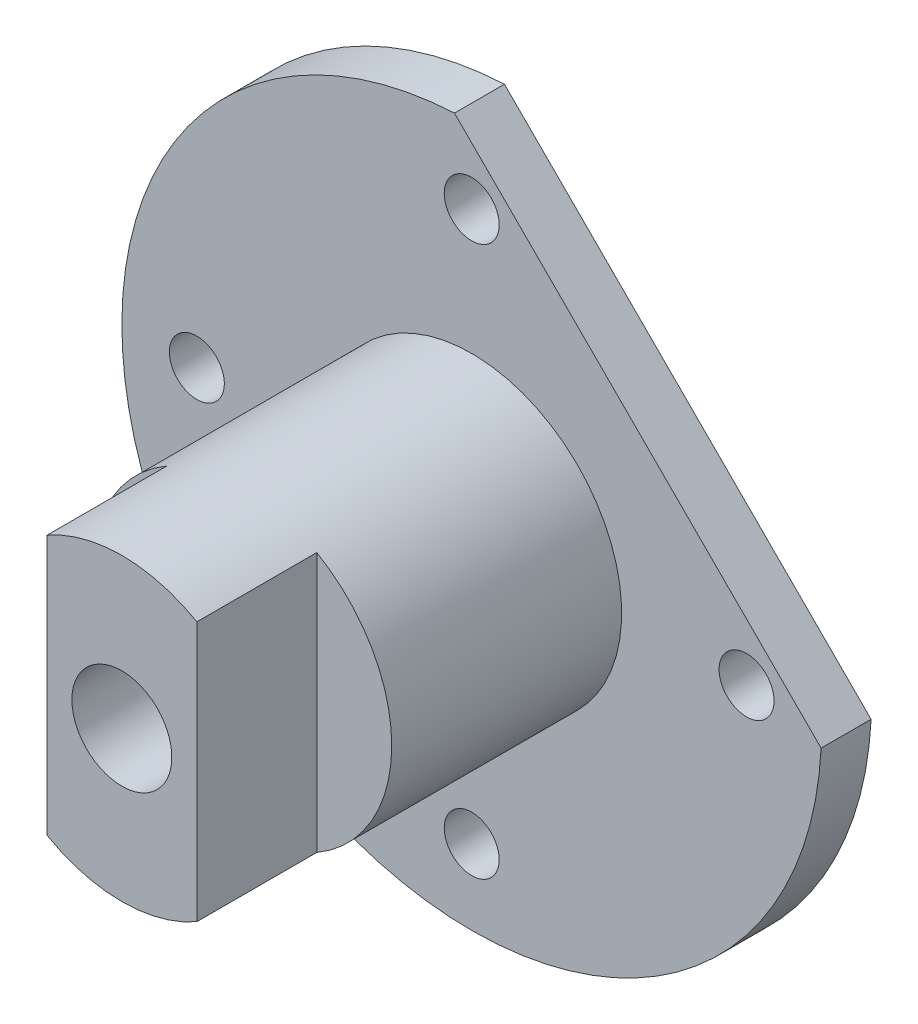
ISO-10303-21;
HEADER;
FILE_DESCRIPTION(('STEP AP214'),'2;1');
FILE_NAME('part.step','',(''),(''),'','','');
FILE_SCHEMA(('AUTOMOTIVE_DESIGN { 1 0 10303 214 1 1 1 1 }'));
ENDSEC;
DATA;
#1=APPLICATION_CONTEXT('core data for automotive mechanical design processes');
#2=APPLICATION_PROTOCOL_DEFINITION('international standard','automotive_design',2000,#1);
#3=PRODUCT_CONTEXT('',#1,'mechanical');
#4=PRODUCT('Part','Part','',(#3));
#5=PRODUCT_RELATED_PRODUCT_CATEGORY('part','',(#4));
#6=PRODUCT_DEFINITION_FORMATION('','',#4);
#7=PRODUCT_DEFINITION_CONTEXT('part definition',#1,'design');
#8=PRODUCT_DEFINITION('design','',#6,#7);
#9=PRODUCT_DEFINITION_SHAPE('','',#8);
#10=(LENGTH_UNIT() NAMED_UNIT(*) SI_UNIT(.MILLI.,.METRE.));
#11=(NAMED_UNIT(*) PLANE_ANGLE_UNIT() SI_UNIT($,.RADIAN.));
#12=(NAMED_UNIT(*) SI_UNIT($,.STERADIAN.) SOLID_ANGLE_UNIT());
#13=UNCERTAINTY_MEASURE_WITH_UNIT(LENGTH_MEASURE(1.E-05),#10,'distance_accuracy_value','');
#14=(GEOMETRIC_REPRESENTATION_CONTEXT(3) GLOBAL_UNCERTAINTY_ASSIGNED_CONTEXT((#13)) GLOBAL_UNIT_ASSIGNED_CONTEXT((#10,
#11,#12)) REPRESENTATION_CONTEXT('',''));
#15=CARTESIAN_POINT('',(0.,0.,0.));
#16=DIRECTION('',(0.,0.,1.));
#17=DIRECTION('',(1.,0.,0.));
#18=AXIS2_PLACEMENT_3D('',#15,#16,#17);
#19=CARTESIAN_POINT('',(0.,0.,40.));
#20=DIRECTION('',(0.,0.,-1.));
#21=DIRECTION('',(-1.,0.,0.));
#22=AXIS2_PLACEMENT_3D('',#19,#20,#21);
#23=CYLINDRICAL_SURFACE('',#22,15.);
#24=CARTESIAN_POINT('',(0.,0.,5.));
#25=DIRECTION('',(0.,0.,-1.));
#26=DIRECTION('',(-1.,0.,0.));
#27=AXIS2_PLACEMENT_3D('',#24,#25,#26);
#28=CIRCLE('',#27,15.);
#29=CARTESIAN_POINT('',(-15.,0.,5.));
#30=VERTEX_POINT('',#29);
#31=EDGE_CURVE('E146',#30,#30,#28,.T.);
#32=ORIENTED_EDGE('',*,*,#31,.F.);
#33=EDGE_LOOP('',(#32));
#34=FACE_BOUND('',#33,.T.);
#35=DIRECTION('',(0.,0.,-1.));
#36=VECTOR('',#35,1.);
#37=CARTESIAN_POINT('',(-7.5,12.9903810567666,40.));
#38=LINE('',#37,#36);
#39=CARTESIAN_POINT('',(-7.5,12.9903810567666,40.));
#40=VERTEX_POINT('',#39);
#41=CARTESIAN_POINT('',(-7.5,12.9903810567666,28.));
#42=VERTEX_POINT('',#41);
#43=EDGE_CURVE('E176',#40,#42,#38,.T.);
#44=ORIENTED_EDGE('',*,*,#43,.F.);
#45=CARTESIAN_POINT('',(0.,0.,40.));
#46=DIRECTION('',(0.,0.,1.));
#47=DIRECTION('',(1.,0.,0.));
#48=AXIS2_PLACEMENT_3D('',#45,#46,#47);
#49=CIRCLE('',#48,15.);
#50=CARTESIAN_POINT('',(7.5,12.9903810567666,40.));
#51=VERTEX_POINT('',#50);
#52=EDGE_CURVE('E143',#51,#40,#49,.T.);
#53=ORIENTED_EDGE('',*,*,#52,.F.);
#54=DIRECTION('',(0.,0.,-1.));
#55=VECTOR('',#54,1.);
#56=CARTESIAN_POINT('',(7.5,12.9903810567666,40.));
#57=LINE('',#56,#55);
#58=CARTESIAN_POINT('',(7.5,12.9903810567666,28.));
#59=VERTEX_POINT('',#58);
#60=EDGE_CURVE('E171',#51,#59,#57,.T.);
#61=ORIENTED_EDGE('',*,*,#60,.T.);
#62=CARTESIAN_POINT('',(0.,0.,28.));
#63=DIRECTION('',(0.,0.,-1.));
#64=DIRECTION('',(-1.,0.,0.));
#65=AXIS2_PLACEMENT_3D('',#62,#63,#64);
#66=CIRCLE('',#65,15.);
#67=CARTESIAN_POINT('',(7.5,-12.9903810567666,28.));
#68=VERTEX_POINT('',#67);
#69=EDGE_CURVE('E155',#59,#68,#66,.T.);
#70=ORIENTED_EDGE('',*,*,#69,.T.);
#71=DIRECTION('',(0.,0.,-1.));
#72=VECTOR('',#71,1.);
#73=CARTESIAN_POINT('',(7.5,-12.9903810567666,40.));
#74=LINE('',#73,#72);
#75=CARTESIAN_POINT('',(7.5,-12.9903810567666,40.));
#76=VERTEX_POINT('',#75);
#77=EDGE_CURVE('E166',#68,#76,#74,.F.);
#78=ORIENTED_EDGE('',*,*,#77,.T.);
#79=CARTESIAN_POINT('',(-7.5,-12.9903810567666,40.));
#80=VERTEX_POINT('',#79);
#81=EDGE_CURVE('E137',#80,#76,#49,.T.);
#82=ORIENTED_EDGE('',*,*,#81,.F.);
#83=DIRECTION('',(0.,0.,-1.));
#84=VECTOR('',#83,1.);
#85=CARTESIAN_POINT('',(-7.5,-12.9903810567666,40.));
#86=LINE('',#85,#84);
#87=CARTESIAN_POINT('',(-7.5,-12.9903810567666,28.));
#88=VERTEX_POINT('',#87);
#89=EDGE_CURVE('E54',#88,#80,#86,.F.);
#90=ORIENTED_EDGE('',*,*,#89,.F.);
#91=CARTESIAN_POINT('',(0.,0.,28.));
#92=DIRECTION('',(0.,0.,1.));
#93=DIRECTION('',(1.,0.,0.));
#94=AXIS2_PLACEMENT_3D('',#91,#92,#93);
#95=CIRCLE('',#94,15.);
#96=EDGE_CURVE('E11',#42,#88,#95,.T.);
#97=ORIENTED_EDGE('',*,*,#96,.F.);
#98=EDGE_LOOP('',(#44,#53,#61,#70,#78,#82,#90,#97));
#99=FACE_BOUND('',#98,.T.);
#100=ADVANCED_FACE('F32',(#34,#99),#23,.T.);
#101=CARTESIAN_POINT('',(0.,0.,40.));
#102=DIRECTION('',(0.,0.,1.));
#103=DIRECTION('',(1.,0.,0.));
#104=AXIS2_PLACEMENT_3D('',#101,#102,#103);
#105=PLANE('',#104);
#106=CARTESIAN_POINT('',(0.,0.,40.));
#107=DIRECTION('',(0.,0.,-1.));
#108=DIRECTION('',(-1.,0.,0.));
#109=AXIS2_PLACEMENT_3D('',#106,#107,#108);
#110=CIRCLE('',#109,5.);
#111=CARTESIAN_POINT('',(-5.,0.,40.));
#112=VERTEX_POINT('',#111);
#113=EDGE_CURVE('E135',#112,#112,#110,.T.);
#114=ORIENTED_EDGE('',*,*,#113,.T.);
#115=EDGE_LOOP('',(#114));
#116=FACE_BOUND('',#115,.T.);
#117=ORIENTED_EDGE('',*,*,#52,.T.);
#118=DIRECTION('',(0.,-1.,0.));
#119=VECTOR('',#118,1.);
#120=CARTESIAN_POINT('',(-7.5,0.,40.));
#121=LINE('',#120,#119);
#122=EDGE_CURVE('E39',#40,#80,#121,.T.);
#123=ORIENTED_EDGE('',*,*,#122,.T.);
#124=ORIENTED_EDGE('',*,*,#81,.T.);
#125=DIRECTION('',(0.,-1.,0.));
#126=VECTOR('',#125,1.);
#127=CARTESIAN_POINT('',(7.5,0.,40.));
#128=LINE('',#127,#126);
#129=EDGE_CURVE('E149',#51,#76,#128,.T.);
#130=ORIENTED_EDGE('',*,*,#129,.F.);
#131=EDGE_LOOP('',(#117,#123,#124,#130));
#132=FACE_BOUND('',#131,.T.);
#133=ADVANCED_FACE('F159',(#116,#132),#105,.T.);
#134=CARTESIAN_POINT('',(0.,0.,40.));
#135=DIRECTION('',(0.,0.,-1.));
#136=DIRECTION('',(-1.,0.,0.));
#137=AXIS2_PLACEMENT_3D('',#134,#135,#136);
#138=CYLINDRICAL_SURFACE('',#137,5.);
#139=ORIENTED_EDGE('',*,*,#113,.F.);
#140=EDGE_LOOP('',(#139));
#141=FACE_BOUND('',#140,.T.);
#142=CARTESIAN_POINT('',(0.,0.,10.));
#143=DIRECTION('',(0.,0.,-1.));
#144=DIRECTION('',(-1.,0.,0.));
#145=AXIS2_PLACEMENT_3D('',#142,#143,#144);
#146=CIRCLE('',#145,5.);
#147=CARTESIAN_POINT('',(-5.,0.,10.));
#148=VERTEX_POINT('',#147);
#149=EDGE_CURVE('E140',#148,#148,#146,.F.);
#150=ORIENTED_EDGE('',*,*,#149,.F.);
#151=EDGE_LOOP('',(#150));
#152=FACE_BOUND('',#151,.T.);
#153=ADVANCED_FACE('F266',(#141,#152),#138,.F.);
#154=CARTESIAN_POINT('',(0.,0.,5.));
#155=DIRECTION('',(0.,0.,-1.));
#156=DIRECTION('',(-1.,0.,0.));
#157=AXIS2_PLACEMENT_3D('',#154,#155,#156);
#158=PLANE('',#157);
#159=CARTESIAN_POINT('',(0.,27.5,5.));
#160=DIRECTION('',(0.,0.,-1.));
#161=DIRECTION('',(-1.,0.,0.));
#162=AXIS2_PLACEMENT_3D('',#159,#160,#161);
#163=CIRCLE('',#162,2.74999999999999);
#164=CARTESIAN_POINT('',(-2.74999999999999,27.5,5.));
#165=VERTEX_POINT('',#164);
#166=EDGE_CURVE('E429',#165,#165,#163,.T.);
#167=ORIENTED_EDGE('',*,*,#166,.T.);
#168=EDGE_LOOP('',(#167));
#169=FACE_BOUND('',#168,.T.);
#170=CARTESIAN_POINT('',(27.5,0.,5.));
#171=DIRECTION('',(0.,0.,-1.));
#172=DIRECTION('',(-1.,0.,0.));
#173=AXIS2_PLACEMENT_3D('',#170,#171,#172);
#174=CIRCLE('',#173,2.74999999999999);
#175=CARTESIAN_POINT('',(24.75,0.,5.));
#176=VERTEX_POINT('',#175);
#177=EDGE_CURVE('E431',#176,#176,#174,.T.);
#178=ORIENTED_EDGE('',*,*,#177,.T.);
#179=EDGE_LOOP('',(#178));
#180=FACE_BOUND('',#179,.T.);
#181=CARTESIAN_POINT('',(-27.5,0.,5.));
#182=DIRECTION('',(0.,0.,-1.));
#183=DIRECTION('',(-1.,0.,0.));
#184=AXIS2_PLACEMENT_3D('',#181,#182,#183);
#185=CIRCLE('',#184,2.74999999999999);
#186=CARTESIAN_POINT('',(-30.25,0.,5.));
#187=VERTEX_POINT('',#186);
#188=EDGE_CURVE('E310',#187,#187,#185,.T.);
#189=ORIENTED_EDGE('',*,*,#188,.T.);
#190=EDGE_LOOP('',(#189));
#191=FACE_BOUND('',#190,.T.);
#192=CARTESIAN_POINT('',(0.,-27.5,5.));
#193=DIRECTION('',(0.,0.,-1.));
#194=DIRECTION('',(-1.,0.,0.));
#195=AXIS2_PLACEMENT_3D('',#192,#193,#194);
#196=CIRCLE('',#195,2.74999999999999);
#197=CARTESIAN_POINT('',(-2.74999999999999,-27.5,5.));
#198=VERTEX_POINT('',#197);
#199=EDGE_CURVE('E309',#198,#198,#196,.T.);
#200=ORIENTED_EDGE('',*,*,#199,.T.);
#201=EDGE_LOOP('',(#200));
#202=FACE_BOUND('',#201,.T.);
#203=CARTESIAN_POINT('',(0.,0.,5.));
#204=DIRECTION('',(0.,0.,-1.));
#205=DIRECTION('',(-1.,0.,0.));
#206=AXIS2_PLACEMENT_3D('',#203,#204,#205);
#207=CIRCLE('',#206,35.);
#208=CARTESIAN_POINT('',(34.9575382488401,-1.72351953307244,5.));
#209=VERTEX_POINT('',#208);
#210=CARTESIAN_POINT('',(-1.72351953307231,34.9575382488401,5.));
#211=VERTEX_POINT('',#210);
#212=EDGE_CURVE('E131',#209,#211,#207,.T.);
#213=ORIENTED_EDGE('',*,*,#212,.F.);
#214=DIRECTION('',(-0.707106781186546,0.707106781186549,0.));
#215=VECTOR('',#214,1.);
#216=CARTESIAN_POINT('',(16.6170093578839,16.6170093578838,5.));
#217=LINE('',#216,#215);
#218=EDGE_CURVE('E132',#209,#211,#217,.T.);
#219=ORIENTED_EDGE('',*,*,#218,.T.);
#220=EDGE_LOOP('',(#213,#219));
#221=FACE_BOUND('',#220,.T.);
#222=ORIENTED_EDGE('',*,*,#31,.T.);
#223=EDGE_LOOP('',(#222));
#224=FACE_BOUND('',#223,.T.);
#225=ADVANCED_FACE('F271',(#169,#180,#191,#202,#221,#224),#158,.F.);
#226=CARTESIAN_POINT('',(0.,0.,5.));
#227=DIRECTION('',(0.,0.,-1.));
#228=DIRECTION('',(-1.,0.,0.));
#229=AXIS2_PLACEMENT_3D('',#226,#227,#228);
#230=CYLINDRICAL_SURFACE('',#229,35.);
#231=DIRECTION('',(0.,0.,-1.));
#232=VECTOR('',#231,1.);
#233=CARTESIAN_POINT('',(-1.72351953307231,34.9575382488401,40.));
#234=LINE('',#233,#232);
#235=CARTESIAN_POINT('',(-1.72351953307231,34.9575382488401,0.));
#236=VERTEX_POINT('',#235);
#237=EDGE_CURVE('E120',#211,#236,#234,.T.);
#238=ORIENTED_EDGE('',*,*,#237,.T.);
#239=CARTESIAN_POINT('',(0.,0.,0.));
#240=DIRECTION('',(0.,0.,-1.));
#241=DIRECTION('',(-1.,0.,0.));
#242=AXIS2_PLACEMENT_3D('',#239,#240,#241);
#243=CIRCLE('',#242,35.);
#244=CARTESIAN_POINT('',(34.9575382488401,-1.72351953307245,0.));
#245=VERTEX_POINT('',#244);
#246=EDGE_CURVE('E129',#245,#236,#243,.T.);
#247=ORIENTED_EDGE('',*,*,#246,.F.);
#248=DIRECTION('',(0.,0.,-1.));
#249=VECTOR('',#248,1.);
#250=CARTESIAN_POINT('',(34.9575382488401,-1.72351953307244,40.));
#251=LINE('',#250,#249);
#252=EDGE_CURVE('E46',#209,#245,#251,.T.);
#253=ORIENTED_EDGE('',*,*,#252,.F.);
#254=ORIENTED_EDGE('',*,*,#212,.T.);
#255=EDGE_LOOP('',(#238,#247,#253,#254));
#256=FACE_BOUND('',#255,.T.);
#257=ADVANCED_FACE('F128',(#256),#230,.T.);
#258=CARTESIAN_POINT('',(0.,0.,0.));
#259=DIRECTION('',(0.,0.,1.));
#260=DIRECTION('',(1.,0.,0.));
#261=AXIS2_PLACEMENT_3D('',#258,#259,#260);
#262=PLANE('',#261);
#263=CARTESIAN_POINT('',(0.,27.5,0.));
#264=DIRECTION('',(0.,0.,-1.));
#265=DIRECTION('',(-1.,0.,0.));
#266=AXIS2_PLACEMENT_3D('',#263,#264,#265);
#267=CIRCLE('',#266,2.74999999999999);
#268=CARTESIAN_POINT('',(-2.74999999999999,27.5,0.));
#269=VERTEX_POINT('',#268);
#270=EDGE_CURVE('E296',#269,#269,#267,.T.);
#271=ORIENTED_EDGE('',*,*,#270,.F.);
#272=EDGE_LOOP('',(#271));
#273=FACE_BOUND('',#272,.T.);
#274=CARTESIAN_POINT('',(27.5,0.,0.));
#275=DIRECTION('',(0.,0.,-1.));
#276=DIRECTION('',(-1.,0.,0.));
#277=AXIS2_PLACEMENT_3D('',#274,#275,#276);
#278=CIRCLE('',#277,2.74999999999999);
#279=CARTESIAN_POINT('',(24.75,0.,0.));
#280=VERTEX_POINT('',#279);
#281=EDGE_CURVE('E300',#280,#280,#278,.T.);
#282=ORIENTED_EDGE('',*,*,#281,.F.);
#283=EDGE_LOOP('',(#282));
#284=FACE_BOUND('',#283,.T.);
#285=CARTESIAN_POINT('',(-27.5,0.,0.));
#286=DIRECTION('',(0.,0.,-1.));
#287=DIRECTION('',(-1.,0.,0.));
#288=AXIS2_PLACEMENT_3D('',#285,#286,#287);
#289=CIRCLE('',#288,2.74999999999999);
#290=CARTESIAN_POINT('',(-30.25,0.,0.));
#291=VERTEX_POINT('',#290);
#292=EDGE_CURVE('E304',#291,#291,#289,.T.);
#293=ORIENTED_EDGE('',*,*,#292,.F.);
#294=EDGE_LOOP('',(#293));
#295=FACE_BOUND('',#294,.T.);
#296=CARTESIAN_POINT('',(0.,-27.5,0.));
#297=DIRECTION('',(0.,0.,-1.));
#298=DIRECTION('',(-1.,0.,0.));
#299=AXIS2_PLACEMENT_3D('',#296,#297,#298);
#300=CIRCLE('',#299,2.74999999999999);
#301=CARTESIAN_POINT('',(-2.74999999999999,-27.5,0.));
#302=VERTEX_POINT('',#301);
#303=EDGE_CURVE('E307',#302,#302,#300,.T.);
#304=ORIENTED_EDGE('',*,*,#303,.F.);
#305=EDGE_LOOP('',(#304));
#306=FACE_BOUND('',#305,.T.);
#307=DIRECTION('',(0.5,0.866025403784439,0.));
#308=VECTOR('',#307,1.);
#309=CARTESIAN_POINT('',(-8.,0.,0.));
#310=LINE('',#309,#308);
#311=CARTESIAN_POINT('',(-8.,0.,0.));
#312=VERTEX_POINT('',#311);
#313=CARTESIAN_POINT('',(-4.,6.92820323027551,0.));
#314=VERTEX_POINT('',#313);
#315=EDGE_CURVE('E201',#312,#314,#310,.T.);
#316=ORIENTED_EDGE('',*,*,#315,.F.);
#317=DIRECTION('',(-0.5,0.866025403784439,0.));
#318=VECTOR('',#317,1.);
#319=CARTESIAN_POINT('',(-4.,-6.92820323027551,0.));
#320=LINE('',#319,#318);
#321=CARTESIAN_POINT('',(-4.,-6.92820323027551,0.));
#322=VERTEX_POINT('',#321);
#323=EDGE_CURVE('E174',#322,#312,#320,.T.);
#324=ORIENTED_EDGE('',*,*,#323,.F.);
#325=DIRECTION('',(-1.,0.,0.));
#326=VECTOR('',#325,1.);
#327=CARTESIAN_POINT('',(4.,-6.92820323027551,0.));
#328=LINE('',#327,#326);
#329=CARTESIAN_POINT('',(4.,-6.92820323027551,0.));
#330=VERTEX_POINT('',#329);
#331=EDGE_CURVE('E184',#330,#322,#328,.T.);
#332=ORIENTED_EDGE('',*,*,#331,.F.);
#333=DIRECTION('',(-0.5,-0.866025403784439,0.));
#334=VECTOR('',#333,1.);
#335=CARTESIAN_POINT('',(8.,0.,0.));
#336=LINE('',#335,#334);
#337=CARTESIAN_POINT('',(8.,0.,0.));
#338=VERTEX_POINT('',#337);
#339=EDGE_CURVE('E210',#338,#330,#336,.T.);
#340=ORIENTED_EDGE('',*,*,#339,.F.);
#341=DIRECTION('',(0.5,-0.866025403784439,0.));
#342=VECTOR('',#341,1.);
#343=CARTESIAN_POINT('',(4.,6.92820323027551,0.));
#344=LINE('',#343,#342);
#345=CARTESIAN_POINT('',(4.,6.92820323027551,0.));
#346=VERTEX_POINT('',#345);
#347=EDGE_CURVE('E207',#346,#338,#344,.T.);
#348=ORIENTED_EDGE('',*,*,#347,.F.);
#349=DIRECTION('',(1.,0.,0.));
#350=VECTOR('',#349,1.);
#351=CARTESIAN_POINT('',(-4.,6.92820323027551,0.));
#352=LINE('',#351,#350);
#353=EDGE_CURVE('E204',#314,#346,#352,.T.);
#354=ORIENTED_EDGE('',*,*,#353,.F.);
#355=EDGE_LOOP('',(#316,#324,#332,#340,#348,#354));
#356=FACE_BOUND('',#355,.T.);
#357=ORIENTED_EDGE('',*,*,#246,.T.);
#358=DIRECTION('',(-0.707106781186546,0.707106781186549,0.));
#359=VECTOR('',#358,1.);
#360=CARTESIAN_POINT('',(34.9575382488401,-1.72351953307244,0.));
#361=LINE('',#360,#359);
#362=EDGE_CURVE('E117',#245,#236,#361,.T.);
#363=ORIENTED_EDGE('',*,*,#362,.F.);
#364=EDGE_LOOP('',(#357,#363));
#365=FACE_BOUND('',#364,.T.);
#366=ADVANCED_FACE('F134',(#273,#284,#295,#306,#356,#365),#262,.F.);
#367=CARTESIAN_POINT('',(0.,0.,10.));
#368=DIRECTION('',(0.,0.,-1.));
#369=DIRECTION('',(-1.,0.,0.));
#370=AXIS2_PLACEMENT_3D('',#367,#368,#369);
#371=PLANE('',#370);
#372=DIRECTION('',(-0.5,0.866025403784439,0.));
#373=VECTOR('',#372,1.);
#374=CARTESIAN_POINT('',(-4.,-6.92820323027551,10.));
#375=LINE('',#374,#373);
#376=CARTESIAN_POINT('',(-4.,-6.92820323027551,10.));
#377=VERTEX_POINT('',#376);
#378=CARTESIAN_POINT('',(-8.,0.,10.));
#379=VERTEX_POINT('',#378);
#380=EDGE_CURVE('E180',#377,#379,#375,.T.);
#381=ORIENTED_EDGE('',*,*,#380,.T.);
#382=DIRECTION('',(0.5,0.866025403784439,0.));
#383=VECTOR('',#382,1.);
#384=CARTESIAN_POINT('',(-8.,0.,10.));
#385=LINE('',#384,#383);
#386=CARTESIAN_POINT('',(-4.,6.92820323027551,10.));
#387=VERTEX_POINT('',#386);
#388=EDGE_CURVE('E183',#379,#387,#385,.T.);
#389=ORIENTED_EDGE('',*,*,#388,.T.);
#390=DIRECTION('',(1.,0.,0.));
#391=VECTOR('',#390,1.);
#392=CARTESIAN_POINT('',(-4.,6.92820323027551,10.));
#393=LINE('',#392,#391);
#394=CARTESIAN_POINT('',(4.,6.92820323027551,10.));
#395=VERTEX_POINT('',#394);
#396=EDGE_CURVE('E187',#387,#395,#393,.T.);
#397=ORIENTED_EDGE('',*,*,#396,.T.);
#398=DIRECTION('',(0.5,-0.866025403784439,0.));
#399=VECTOR('',#398,1.);
#400=CARTESIAN_POINT('',(4.,6.92820323027551,10.));
#401=LINE('',#400,#399);
#402=CARTESIAN_POINT('',(8.,0.,10.));
#403=VERTEX_POINT('',#402);
#404=EDGE_CURVE('E190',#395,#403,#401,.T.);
#405=ORIENTED_EDGE('',*,*,#404,.T.);
#406=DIRECTION('',(-0.5,-0.866025403784439,0.));
#407=VECTOR('',#406,1.);
#408=CARTESIAN_POINT('',(8.,0.,10.));
#409=LINE('',#408,#407);
#410=CARTESIAN_POINT('',(4.,-6.92820323027551,10.));
#411=VERTEX_POINT('',#410);
#412=EDGE_CURVE('E193',#403,#411,#409,.T.);
#413=ORIENTED_EDGE('',*,*,#412,.T.);
#414=DIRECTION('',(-1.,0.,0.));
#415=VECTOR('',#414,1.);
#416=CARTESIAN_POINT('',(4.,-6.92820323027551,10.));
#417=LINE('',#416,#415);
#418=EDGE_CURVE('E196',#411,#377,#417,.T.);
#419=ORIENTED_EDGE('',*,*,#418,.T.);
#420=EDGE_LOOP('',(#381,#389,#397,#405,#413,#419));
#421=FACE_BOUND('',#420,.T.);
#422=ORIENTED_EDGE('',*,*,#149,.T.);
#423=EDGE_LOOP('',(#422));
#424=FACE_BOUND('',#423,.T.);
#425=ADVANCED_FACE('F242',(#421,#424),#371,.T.);
#426=CARTESIAN_POINT('',(-4.,-6.92820323027551,10.));
#427=DIRECTION('',(-0.866025403784439,-0.5,0.));
#428=DIRECTION('',(0.5,-0.866025403784439,0.));
#429=AXIS2_PLACEMENT_3D('',#426,#427,#428);
#430=PLANE('',#429);
#431=ORIENTED_EDGE('',*,*,#323,.T.);
#432=DIRECTION('',(0.,0.,-1.));
#433=VECTOR('',#432,1.);
#434=CARTESIAN_POINT('',(-8.,0.,10.));
#435=LINE('',#434,#433);
#436=EDGE_CURVE('E199',#379,#312,#435,.T.);
#437=ORIENTED_EDGE('',*,*,#436,.F.);
#438=ORIENTED_EDGE('',*,*,#380,.F.);
#439=DIRECTION('',(0.,0.,-1.));
#440=VECTOR('',#439,1.);
#441=CARTESIAN_POINT('',(-4.,-6.92820323027551,10.));
#442=LINE('',#441,#440);
#443=EDGE_CURVE('E152',#377,#322,#442,.T.);
#444=ORIENTED_EDGE('',*,*,#443,.T.);
#445=EDGE_LOOP('',(#431,#437,#438,#444));
#446=FACE_BOUND('',#445,.T.);
#447=ADVANCED_FACE('F245',(#446),#430,.F.);
#448=CARTESIAN_POINT('',(4.,-6.92820323027551,10.));
#449=DIRECTION('',(0.,-1.,0.));
#450=DIRECTION('',(1.,0.,0.));
#451=AXIS2_PLACEMENT_3D('',#448,#449,#450);
#452=PLANE('',#451);
#453=ORIENTED_EDGE('',*,*,#331,.T.);
#454=ORIENTED_EDGE('',*,*,#443,.F.);
#455=ORIENTED_EDGE('',*,*,#418,.F.);
#456=DIRECTION('',(0.,0.,-1.));
#457=VECTOR('',#456,1.);
#458=CARTESIAN_POINT('',(4.,-6.92820323027551,10.));
#459=LINE('',#458,#457);
#460=EDGE_CURVE('E216',#411,#330,#459,.T.);
#461=ORIENTED_EDGE('',*,*,#460,.T.);
#462=EDGE_LOOP('',(#453,#454,#455,#461));
#463=FACE_BOUND('',#462,.T.);
#464=ADVANCED_FACE('F247',(#463),#452,.F.);
#465=CARTESIAN_POINT('',(8.,0.,10.));
#466=DIRECTION('',(0.866025403784439,-0.5,0.));
#467=DIRECTION('',(0.5,0.866025403784439,0.));
#468=AXIS2_PLACEMENT_3D('',#465,#466,#467);
#469=PLANE('',#468);
#470=ORIENTED_EDGE('',*,*,#339,.T.);
#471=ORIENTED_EDGE('',*,*,#460,.F.);
#472=ORIENTED_EDGE('',*,*,#412,.F.);
#473=DIRECTION('',(0.,0.,-1.));
#474=VECTOR('',#473,1.);
#475=CARTESIAN_POINT('',(8.,0.,10.));
#476=LINE('',#475,#474);
#477=EDGE_CURVE('E218',#403,#338,#476,.T.);
#478=ORIENTED_EDGE('',*,*,#477,.T.);
#479=EDGE_LOOP('',(#470,#471,#472,#478));
#480=FACE_BOUND('',#479,.T.);
#481=ADVANCED_FACE('F249',(#480),#469,.F.);
#482=CARTESIAN_POINT('',(4.,6.92820323027551,10.));
#483=DIRECTION('',(0.866025403784439,0.5,0.));
#484=DIRECTION('',(-0.5,0.866025403784439,0.));
#485=AXIS2_PLACEMENT_3D('',#482,#483,#484);
#486=PLANE('',#485);
#487=ORIENTED_EDGE('',*,*,#347,.T.);
#488=ORIENTED_EDGE('',*,*,#477,.F.);
#489=ORIENTED_EDGE('',*,*,#404,.F.);
#490=DIRECTION('',(0.,0.,-1.));
#491=VECTOR('',#490,1.);
#492=CARTESIAN_POINT('',(4.,6.92820323027551,10.));
#493=LINE('',#492,#491);
#494=EDGE_CURVE('E220',#395,#346,#493,.T.);
#495=ORIENTED_EDGE('',*,*,#494,.T.);
#496=EDGE_LOOP('',(#487,#488,#489,#495));
#497=FACE_BOUND('',#496,.T.);
#498=ADVANCED_FACE('F252',(#497),#486,.F.);
#499=CARTESIAN_POINT('',(-4.,6.92820323027551,10.));
#500=DIRECTION('',(0.,1.,0.));
#501=DIRECTION('',(0.,0.,1.));
#502=AXIS2_PLACEMENT_3D('',#499,#500,#501);
#503=PLANE('',#502);
#504=ORIENTED_EDGE('',*,*,#353,.T.);
#505=ORIENTED_EDGE('',*,*,#494,.F.);
#506=ORIENTED_EDGE('',*,*,#396,.F.);
#507=DIRECTION('',(0.,0.,-1.));
#508=VECTOR('',#507,1.);
#509=CARTESIAN_POINT('',(-4.,6.92820323027551,10.));
#510=LINE('',#509,#508);
#511=EDGE_CURVE('E222',#387,#314,#510,.T.);
#512=ORIENTED_EDGE('',*,*,#511,.T.);
#513=EDGE_LOOP('',(#504,#505,#506,#512));
#514=FACE_BOUND('',#513,.T.);
#515=ADVANCED_FACE('F238',(#514),#503,.F.);
#516=CARTESIAN_POINT('',(-8.,0.,10.));
#517=DIRECTION('',(-0.866025403784438,0.5,0.));
#518=DIRECTION('',(-0.5,-0.866025403784439,0.));
#519=AXIS2_PLACEMENT_3D('',#516,#517,#518);
#520=PLANE('',#519);
#521=ORIENTED_EDGE('',*,*,#315,.T.);
#522=ORIENTED_EDGE('',*,*,#511,.F.);
#523=ORIENTED_EDGE('',*,*,#388,.F.);
#524=ORIENTED_EDGE('',*,*,#436,.T.);
#525=EDGE_LOOP('',(#521,#522,#523,#524));
#526=FACE_BOUND('',#525,.T.);
#527=ADVANCED_FACE('F228',(#526),#520,.F.);
#528=CARTESIAN_POINT('',(15.,-35.,28.));
#529=DIRECTION('',(0.,0.,-1.));
#530=DIRECTION('',(-1.,0.,0.));
#531=AXIS2_PLACEMENT_3D('',#528,#529,#530);
#532=PLANE('',#531);
#533=DIRECTION('',(0.,1.,0.));
#534=VECTOR('',#533,1.);
#535=CARTESIAN_POINT('',(7.5,-35.,28.));
#536=LINE('',#535,#534);
#537=EDGE_CURVE('E172',#68,#59,#536,.T.);
#538=ORIENTED_EDGE('',*,*,#537,.F.);
#539=ORIENTED_EDGE('',*,*,#69,.F.);
#540=EDGE_LOOP('',(#538,#539));
#541=FACE_BOUND('',#540,.T.);
#542=ADVANCED_FACE('F333',(#541),#532,.F.);
#543=CARTESIAN_POINT('',(7.5,-35.,40.));
#544=DIRECTION('',(-1.,0.,0.));
#545=DIRECTION('',(0.,0.,1.));
#546=AXIS2_PLACEMENT_3D('',#543,#544,#545);
#547=PLANE('',#546);
#548=ORIENTED_EDGE('',*,*,#129,.T.);
#549=ORIENTED_EDGE('',*,*,#77,.F.);
#550=ORIENTED_EDGE('',*,*,#537,.T.);
#551=ORIENTED_EDGE('',*,*,#60,.F.);
#552=EDGE_LOOP('',(#548,#549,#550,#551));
#553=FACE_BOUND('',#552,.T.);
#554=ADVANCED_FACE('F325',(#553),#547,.F.);
#555=CARTESIAN_POINT('',(-15.,-35.,28.));
#556=DIRECTION('',(0.,0.,1.));
#557=DIRECTION('',(1.,0.,0.));
#558=AXIS2_PLACEMENT_3D('',#555,#556,#557);
#559=PLANE('',#558);
#560=DIRECTION('',(0.,1.,0.));
#561=VECTOR('',#560,1.);
#562=CARTESIAN_POINT('',(-7.5,-35.,28.));
#563=LINE('',#562,#561);
#564=EDGE_CURVE('E313',#88,#42,#563,.T.);
#565=ORIENTED_EDGE('',*,*,#564,.T.);
#566=ORIENTED_EDGE('',*,*,#96,.T.);
#567=EDGE_LOOP('',(#565,#566));
#568=FACE_BOUND('',#567,.T.);
#569=ADVANCED_FACE('F323',(#568),#559,.T.);
#570=CARTESIAN_POINT('',(-7.5,-35.,40.));
#571=DIRECTION('',(-1.,0.,0.));
#572=DIRECTION('',(0.,0.,1.));
#573=AXIS2_PLACEMENT_3D('',#570,#571,#572);
#574=PLANE('',#573);
#575=ORIENTED_EDGE('',*,*,#43,.T.);
#576=ORIENTED_EDGE('',*,*,#564,.F.);
#577=ORIENTED_EDGE('',*,*,#89,.T.);
#578=ORIENTED_EDGE('',*,*,#122,.F.);
#579=EDGE_LOOP('',(#575,#576,#577,#578));
#580=FACE_BOUND('',#579,.T.);
#581=ADVANCED_FACE('F321',(#580),#574,.T.);
#582=CARTESIAN_POINT('',(0.,-27.5,0.));
#583=DIRECTION('',(0.,0.,-1.));
#584=DIRECTION('',(-1.,0.,0.));
#585=AXIS2_PLACEMENT_3D('',#582,#583,#584);
#586=CYLINDRICAL_SURFACE('',#585,2.74999999999999);
#587=ORIENTED_EDGE('',*,*,#303,.T.);
#588=EDGE_LOOP('',(#587));
#589=FACE_BOUND('',#588,.T.);
#590=ORIENTED_EDGE('',*,*,#199,.F.);
#591=EDGE_LOOP('',(#590));
#592=FACE_BOUND('',#591,.T.);
#593=ADVANCED_FACE('F331',(#589,#592),#586,.F.);
#594=CARTESIAN_POINT('',(-27.5,0.,0.));
#595=DIRECTION('',(0.,0.,-1.));
#596=DIRECTION('',(-1.,0.,0.));
#597=AXIS2_PLACEMENT_3D('',#594,#595,#596);
#598=CYLINDRICAL_SURFACE('',#597,2.74999999999999);
#599=ORIENTED_EDGE('',*,*,#292,.T.);
#600=EDGE_LOOP('',(#599));
#601=FACE_BOUND('',#600,.T.);
#602=ORIENTED_EDGE('',*,*,#188,.F.);
#603=EDGE_LOOP('',(#602));
#604=FACE_BOUND('',#603,.T.);
#605=ADVANCED_FACE('F390',(#601,#604),#598,.F.);
#606=CARTESIAN_POINT('',(27.5,0.,0.));
#607=DIRECTION('',(0.,0.,-1.));
#608=DIRECTION('',(-1.,0.,0.));
#609=AXIS2_PLACEMENT_3D('',#606,#607,#608);
#610=CYLINDRICAL_SURFACE('',#609,2.74999999999999);
#611=ORIENTED_EDGE('',*,*,#281,.T.);
#612=EDGE_LOOP('',(#611));
#613=FACE_BOUND('',#612,.T.);
#614=ORIENTED_EDGE('',*,*,#177,.F.);
#615=EDGE_LOOP('',(#614));
#616=FACE_BOUND('',#615,.T.);
#617=ADVANCED_FACE('F398',(#613,#616),#610,.F.);
#618=CARTESIAN_POINT('',(0.,27.5,0.));
#619=DIRECTION('',(0.,0.,-1.));
#620=DIRECTION('',(-1.,0.,0.));
#621=AXIS2_PLACEMENT_3D('',#618,#619,#620);
#622=CYLINDRICAL_SURFACE('',#621,2.74999999999999);
#623=ORIENTED_EDGE('',*,*,#270,.T.);
#624=EDGE_LOOP('',(#623));
#625=FACE_BOUND('',#624,.T.);
#626=ORIENTED_EDGE('',*,*,#166,.F.);
#627=EDGE_LOOP('',(#626));
#628=FACE_BOUND('',#627,.T.);
#629=ADVANCED_FACE('F406',(#625,#628),#622,.F.);
#630=CARTESIAN_POINT('',(34.9575382488401,-1.72351953307244,40.));
#631=DIRECTION('',(-0.707106781186549,-0.707106781186546,0.));
#632=DIRECTION('',(0.707106781186546,-0.707106781186549,0.));
#633=AXIS2_PLACEMENT_3D('',#630,#631,#632);
#634=PLANE('',#633);
#635=ORIENTED_EDGE('',*,*,#252,.T.);
#636=ORIENTED_EDGE('',*,*,#362,.T.);
#637=ORIENTED_EDGE('',*,*,#237,.F.);
#638=ORIENTED_EDGE('',*,*,#218,.F.);
#639=EDGE_LOOP('',(#635,#636,#637,#638));
#640=FACE_BOUND('',#639,.T.);
#641=ADVANCED_FACE('F119',(#640),#634,.F.);
#642=CLOSED_SHELL('',(#100,#133,#153,#225,#257,#366,#425,#447,#464,#481,#498,#515,#527,#542,
#554,#569,#581,#593,#605,#617,#629,#641));
#643=MANIFOLD_SOLID_BREP('B2',#642);
#644=ADVANCED_BREP_SHAPE_REPRESENTATION('',(#18,#643),#14);
#645=SHAPE_DEFINITION_REPRESENTATION(#9,#644);
ENDSEC;
END-ISO-10303-21;
